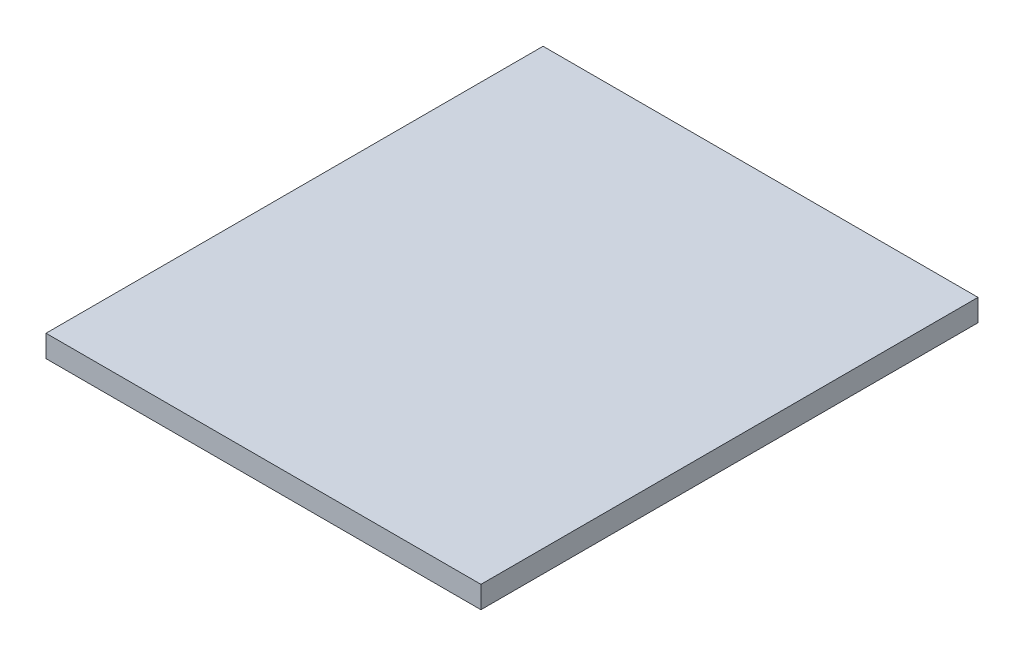
ISO-10303-21;
HEADER;
FILE_DESCRIPTION(('STEP AP214'),'2;1');
FILE_NAME('part.step','',(''),(''),'','','');
FILE_SCHEMA(('AUTOMOTIVE_DESIGN { 1 0 10303 214 1 1 1 1 }'));
ENDSEC;
DATA;
#1=APPLICATION_CONTEXT('core data for automotive mechanical design processes');
#2=APPLICATION_PROTOCOL_DEFINITION('international standard','automotive_design',2000,#1);
#3=PRODUCT_CONTEXT('',#1,'mechanical');
#4=PRODUCT('Part','Part','',(#3));
#5=PRODUCT_RELATED_PRODUCT_CATEGORY('part','',(#4));
#6=PRODUCT_DEFINITION_FORMATION('','',#4);
#7=PRODUCT_DEFINITION_CONTEXT('part definition',#1,'design');
#8=PRODUCT_DEFINITION('design','',#6,#7);
#9=PRODUCT_DEFINITION_SHAPE('','',#8);
#10=(LENGTH_UNIT() NAMED_UNIT(*) SI_UNIT(.MILLI.,.METRE.));
#11=(NAMED_UNIT(*) PLANE_ANGLE_UNIT() SI_UNIT($,.RADIAN.));
#12=(NAMED_UNIT(*) SI_UNIT($,.STERADIAN.) SOLID_ANGLE_UNIT());
#13=UNCERTAINTY_MEASURE_WITH_UNIT(LENGTH_MEASURE(1.E-05),#10,'distance_accuracy_value','');
#14=(GEOMETRIC_REPRESENTATION_CONTEXT(3) GLOBAL_UNCERTAINTY_ASSIGNED_CONTEXT((#13)) GLOBAL_UNIT_ASSIGNED_CONTEXT((#10,
#11,#12)) REPRESENTATION_CONTEXT('',''));
#15=CARTESIAN_POINT('',(0.,0.,0.));
#16=DIRECTION('',(0.,0.,1.));
#17=DIRECTION('',(1.,0.,0.));
#18=AXIS2_PLACEMENT_3D('',#15,#16,#17);
#19=CARTESIAN_POINT('',(-4.3205,2.9756,-2.0828));
#20=DIRECTION('',(1.,0.,0.));
#21=DIRECTION('',(0.,-1.,0.));
#22=AXIS2_PLACEMENT_3D('',#19,#20,#21);
#23=PLANE('',#22);
#24=DIRECTION('',(0.,0.,1.));
#25=VECTOR('',#24,1.);
#26=CARTESIAN_POINT('',(-4.3205,2.9306,-2.0828));
#27=LINE('',#26,#25);
#28=CARTESIAN_POINT('',(-4.3205,2.9306,-3.0988));
#29=VERTEX_POINT('',#28);
#30=CARTESIAN_POINT('',(-4.3205,2.9306,-2.0828));
#31=VERTEX_POINT('',#30);
#32=EDGE_CURVE('E11',#29,#31,#27,.T.);
#33=ORIENTED_EDGE('',*,*,#32,.T.);
#34=DIRECTION('',(0.,-1.,0.));
#35=VECTOR('',#34,1.);
#36=CARTESIAN_POINT('',(-4.3205,2.9756,-2.0828));
#37=LINE('',#36,#35);
#38=CARTESIAN_POINT('',(-4.3205,2.9756,-2.0828));
#39=VERTEX_POINT('',#38);
#40=EDGE_CURVE('E24',#39,#31,#37,.T.);
#41=ORIENTED_EDGE('',*,*,#40,.F.);
#42=DIRECTION('',(0.,0.,1.));
#43=VECTOR('',#42,1.);
#44=CARTESIAN_POINT('',(-4.3205,2.9756,-2.0828));
#45=LINE('',#44,#43);
#46=CARTESIAN_POINT('',(-4.3205,2.9756,-3.0988));
#47=VERTEX_POINT('',#46);
#48=EDGE_CURVE('E88',#47,#39,#45,.T.);
#49=ORIENTED_EDGE('',*,*,#48,.F.);
#50=DIRECTION('',(0.,-1.,0.));
#51=VECTOR('',#50,1.);
#52=CARTESIAN_POINT('',(-4.3205,2.9756,-3.0988));
#53=LINE('',#52,#51);
#54=EDGE_CURVE('E77',#47,#29,#53,.T.);
#55=ORIENTED_EDGE('',*,*,#54,.T.);
#56=EDGE_LOOP('',(#33,#41,#49,#55));
#57=FACE_BOUND('',#56,.T.);
#58=ADVANCED_FACE('F17',(#57),#23,.F.);
#59=CARTESIAN_POINT('',(-3.4315,2.9756,-2.0828));
#60=DIRECTION('',(0.,0.,-1.));
#61=DIRECTION('',(0.,1.,0.));
#62=AXIS2_PLACEMENT_3D('',#59,#60,#61);
#63=PLANE('',#62);
#64=DIRECTION('',(1.,0.,0.));
#65=VECTOR('',#64,1.);
#66=CARTESIAN_POINT('',(-3.4315,2.9306,-2.0828));
#67=LINE('',#66,#65);
#68=CARTESIAN_POINT('',(-3.4315,2.9306,-2.0828));
#69=VERTEX_POINT('',#68);
#70=EDGE_CURVE('E85',#31,#69,#67,.T.);
#71=ORIENTED_EDGE('',*,*,#70,.T.);
#72=DIRECTION('',(0.,-1.,0.));
#73=VECTOR('',#72,1.);
#74=CARTESIAN_POINT('',(-3.4315,2.9756,-2.0828));
#75=LINE('',#74,#73);
#76=CARTESIAN_POINT('',(-3.4315,2.9756,-2.0828));
#77=VERTEX_POINT('',#76);
#78=EDGE_CURVE('E83',#77,#69,#75,.T.);
#79=ORIENTED_EDGE('',*,*,#78,.F.);
#80=DIRECTION('',(1.,0.,0.));
#81=VECTOR('',#80,1.);
#82=CARTESIAN_POINT('',(-3.4315,2.9756,-2.0828));
#83=LINE('',#82,#81);
#84=EDGE_CURVE('E72',#39,#77,#83,.T.);
#85=ORIENTED_EDGE('',*,*,#84,.F.);
#86=ORIENTED_EDGE('',*,*,#40,.T.);
#87=EDGE_LOOP('',(#71,#79,#85,#86));
#88=FACE_BOUND('',#87,.T.);
#89=ADVANCED_FACE('F90',(#88),#63,.F.);
#90=CARTESIAN_POINT('',(-3.4315,2.9756,-3.0988));
#91=DIRECTION('',(-1.,0.,0.));
#92=DIRECTION('',(0.,1.,0.));
#93=AXIS2_PLACEMENT_3D('',#90,#91,#92);
#94=PLANE('',#93);
#95=DIRECTION('',(0.,0.,-1.));
#96=VECTOR('',#95,1.);
#97=CARTESIAN_POINT('',(-3.4315,2.9306,-3.0988));
#98=LINE('',#97,#96);
#99=CARTESIAN_POINT('',(-3.4315,2.9306,-3.0988));
#100=VERTEX_POINT('',#99);
#101=EDGE_CURVE('E60',#69,#100,#98,.T.);
#102=ORIENTED_EDGE('',*,*,#101,.T.);
#103=DIRECTION('',(0.,-1.,0.));
#104=VECTOR('',#103,1.);
#105=CARTESIAN_POINT('',(-3.4315,2.9756,-3.0988));
#106=LINE('',#105,#104);
#107=CARTESIAN_POINT('',(-3.4315,2.9756,-3.0988));
#108=VERTEX_POINT('',#107);
#109=EDGE_CURVE('E54',#108,#100,#106,.T.);
#110=ORIENTED_EDGE('',*,*,#109,.F.);
#111=DIRECTION('',(0.,0.,-1.));
#112=VECTOR('',#111,1.);
#113=CARTESIAN_POINT('',(-3.4315,2.9756,-3.0988));
#114=LINE('',#113,#112);
#115=EDGE_CURVE('E58',#77,#108,#114,.T.);
#116=ORIENTED_EDGE('',*,*,#115,.F.);
#117=ORIENTED_EDGE('',*,*,#78,.T.);
#118=EDGE_LOOP('',(#102,#110,#116,#117));
#119=FACE_BOUND('',#118,.T.);
#120=ADVANCED_FACE('F56',(#119),#94,.F.);
#121=CARTESIAN_POINT('',(-4.3205,2.9756,-3.0988));
#122=DIRECTION('',(0.,0.,1.));
#123=DIRECTION('',(0.,-1.,0.));
#124=AXIS2_PLACEMENT_3D('',#121,#122,#123);
#125=PLANE('',#124);
#126=DIRECTION('',(-1.,0.,0.));
#127=VECTOR('',#126,1.);
#128=CARTESIAN_POINT('',(-4.3205,2.9306,-3.0988));
#129=LINE('',#128,#127);
#130=EDGE_CURVE('E73',#100,#29,#129,.T.);
#131=ORIENTED_EDGE('',*,*,#130,.T.);
#132=ORIENTED_EDGE('',*,*,#54,.F.);
#133=DIRECTION('',(-1.,0.,0.));
#134=VECTOR('',#133,1.);
#135=CARTESIAN_POINT('',(-4.3205,2.9756,-3.0988));
#136=LINE('',#135,#134);
#137=EDGE_CURVE('E70',#108,#47,#136,.T.);
#138=ORIENTED_EDGE('',*,*,#137,.F.);
#139=ORIENTED_EDGE('',*,*,#109,.T.);
#140=EDGE_LOOP('',(#131,#132,#138,#139));
#141=FACE_BOUND('',#140,.T.);
#142=ADVANCED_FACE('F76',(#141),#125,.F.);
#143=CARTESIAN_POINT('',(0.,2.9756,0.));
#144=DIRECTION('',(0.,-1.,0.));
#145=DIRECTION('',(-1.,0.,0.));
#146=AXIS2_PLACEMENT_3D('',#143,#144,#145);
#147=PLANE('',#146);
#148=ORIENTED_EDGE('',*,*,#48,.T.);
#149=ORIENTED_EDGE('',*,*,#84,.T.);
#150=ORIENTED_EDGE('',*,*,#115,.T.);
#151=ORIENTED_EDGE('',*,*,#137,.T.);
#152=EDGE_LOOP('',(#148,#149,#150,#151));
#153=FACE_BOUND('',#152,.T.);
#154=ADVANCED_FACE('F69',(#153),#147,.F.);
#155=CARTESIAN_POINT('',(0.,2.9306,0.));
#156=DIRECTION('',(0.,-1.,0.));
#157=DIRECTION('',(-1.,0.,0.));
#158=AXIS2_PLACEMENT_3D('',#155,#156,#157);
#159=PLANE('',#158);
#160=ORIENTED_EDGE('',*,*,#32,.F.);
#161=ORIENTED_EDGE('',*,*,#130,.F.);
#162=ORIENTED_EDGE('',*,*,#101,.F.);
#163=ORIENTED_EDGE('',*,*,#70,.F.);
#164=EDGE_LOOP('',(#160,#161,#162,#163));
#165=FACE_BOUND('',#164,.T.);
#166=ADVANCED_FACE('F91',(#165),#159,.T.);
#167=CLOSED_SHELL('',(#58,#89,#120,#142,#154,#166));
#168=MANIFOLD_SOLID_BREP('B1',#167);
#169=ADVANCED_BREP_SHAPE_REPRESENTATION('',(#18,#168),#14);
#170=SHAPE_DEFINITION_REPRESENTATION(#9,#169);
ENDSEC;
END-ISO-10303-21;
